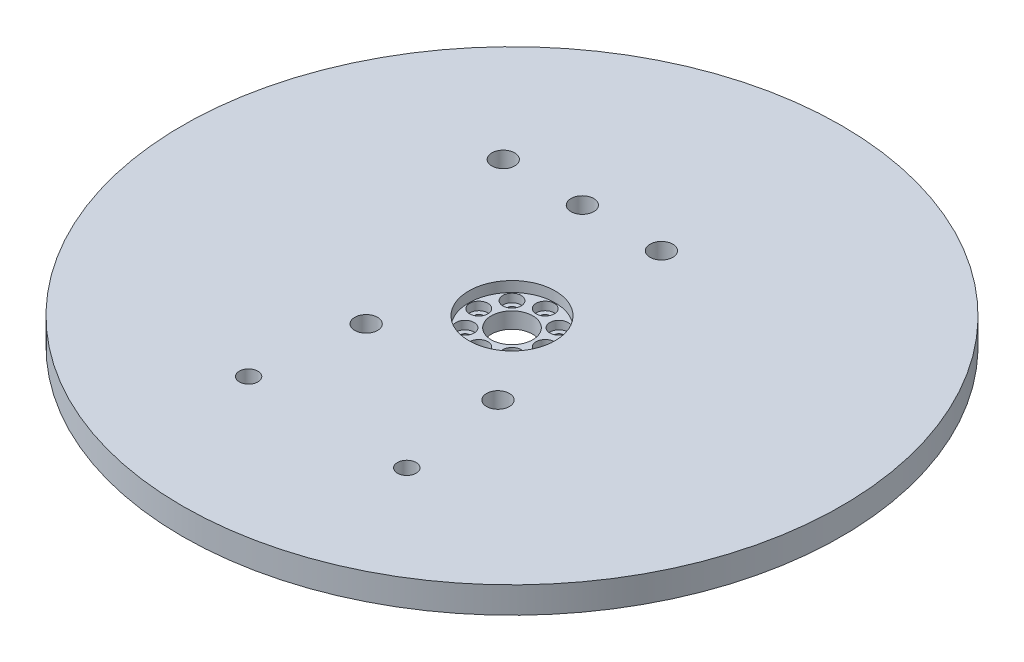
ISO-10303-21;
HEADER;
FILE_DESCRIPTION(('STEP AP214'),'2;1');
FILE_NAME('part.step','',(''),(''),'','','');
FILE_SCHEMA(('AUTOMOTIVE_DESIGN { 1 0 10303 214 1 1 1 1 }'));
ENDSEC;
DATA;
#1=APPLICATION_CONTEXT('core data for automotive mechanical design processes');
#2=APPLICATION_PROTOCOL_DEFINITION('international standard','automotive_design',2000,#1);
#3=PRODUCT_CONTEXT('',#1,'mechanical');
#4=PRODUCT('Part','Part','',(#3));
#5=PRODUCT_RELATED_PRODUCT_CATEGORY('part','',(#4));
#6=PRODUCT_DEFINITION_FORMATION('','',#4);
#7=PRODUCT_DEFINITION_CONTEXT('part definition',#1,'design');
#8=PRODUCT_DEFINITION('design','',#6,#7);
#9=PRODUCT_DEFINITION_SHAPE('','',#8);
#10=(LENGTH_UNIT() NAMED_UNIT(*) SI_UNIT(.MILLI.,.METRE.));
#11=(NAMED_UNIT(*) PLANE_ANGLE_UNIT() SI_UNIT($,.RADIAN.));
#12=(NAMED_UNIT(*) SI_UNIT($,.STERADIAN.) SOLID_ANGLE_UNIT());
#13=UNCERTAINTY_MEASURE_WITH_UNIT(LENGTH_MEASURE(1.E-05),#10,'distance_accuracy_value','');
#14=(GEOMETRIC_REPRESENTATION_CONTEXT(3) GLOBAL_UNCERTAINTY_ASSIGNED_CONTEXT((#13)) GLOBAL_UNIT_ASSIGNED_CONTEXT((#10,
#11,#12)) REPRESENTATION_CONTEXT('',''));
#15=CARTESIAN_POINT('',(0.,0.,0.));
#16=DIRECTION('',(0.,0.,1.));
#17=DIRECTION('',(1.,0.,0.));
#18=AXIS2_PLACEMENT_3D('',#15,#16,#17);
#19=CARTESIAN_POINT('',(0.,3.175,0.));
#20=DIRECTION('',(0.,-1.,0.));
#21=DIRECTION('',(0.,0.,-1.));
#22=AXIS2_PLACEMENT_3D('',#19,#20,#21);
#23=CYLINDRICAL_SURFACE('',#22,79.375);
#24=CARTESIAN_POINT('',(0.,3.175,0.));
#25=DIRECTION('',(0.,1.,0.));
#26=DIRECTION('',(0.,0.,1.));
#27=AXIS2_PLACEMENT_3D('',#24,#25,#26);
#28=CIRCLE('',#27,79.375);
#29=CARTESIAN_POINT('',(0.,3.175,79.375));
#30=VERTEX_POINT('',#29);
#31=EDGE_CURVE('E11',#30,#30,#28,.T.);
#32=ORIENTED_EDGE('',*,*,#31,.F.);
#33=EDGE_LOOP('',(#32));
#34=FACE_BOUND('',#33,.T.);
#35=CARTESIAN_POINT('',(0.,-3.175,0.));
#36=DIRECTION('',(0.,1.,0.));
#37=DIRECTION('',(0.,0.,1.));
#38=AXIS2_PLACEMENT_3D('',#35,#36,#37);
#39=CIRCLE('',#38,79.375);
#40=CARTESIAN_POINT('',(0.,-3.175,79.375));
#41=VERTEX_POINT('',#40);
#42=EDGE_CURVE('E46',#41,#41,#39,.T.);
#43=ORIENTED_EDGE('',*,*,#42,.T.);
#44=EDGE_LOOP('',(#43));
#45=FACE_BOUND('',#44,.T.);
#46=ADVANCED_FACE('F39',(#34,#45),#23,.T.);
#47=CARTESIAN_POINT('',(0.,3.175,0.));
#48=DIRECTION('',(0.,1.,0.));
#49=DIRECTION('',(0.,0.,1.));
#50=AXIS2_PLACEMENT_3D('',#47,#48,#49);
#51=PLANE('',#50);
#52=CARTESIAN_POINT('',(-33.6688086,3.175,-31.5673879519193));
#53=DIRECTION('',(0.,1.,0.));
#54=DIRECTION('',(0.,0.,1.));
#55=AXIS2_PLACEMENT_3D('',#52,#53,#54);
#56=CIRCLE('',#55,2.75);
#57=CARTESIAN_POINT('',(-33.6688086,3.175,-28.8173879519193));
#58=VERTEX_POINT('',#57);
#59=EDGE_CURVE('E362',#58,#58,#56,.T.);
#60=ORIENTED_EDGE('',*,*,#59,.F.);
#61=EDGE_LOOP('',(#60));
#62=FACE_BOUND('',#61,.T.);
#63=CARTESIAN_POINT('',(-14.6188085999999,3.175,-31.5673879519193));
#64=DIRECTION('',(0.,1.,0.));
#65=DIRECTION('',(0.,0.,1.));
#66=AXIS2_PLACEMENT_3D('',#63,#64,#65);
#67=CIRCLE('',#66,2.75);
#68=CARTESIAN_POINT('',(-14.6188085999999,3.175,-28.8173879519193));
#69=VERTEX_POINT('',#68);
#70=EDGE_CURVE('E364',#69,#69,#67,.T.);
#71=ORIENTED_EDGE('',*,*,#70,.F.);
#72=EDGE_LOOP('',(#71));
#73=FACE_BOUND('',#72,.T.);
#74=CARTESIAN_POINT('',(4.43119140000003,3.175,-31.5673879519193));
#75=DIRECTION('',(0.,1.,0.));
#76=DIRECTION('',(0.,0.,1.));
#77=AXIS2_PLACEMENT_3D('',#74,#75,#76);
#78=CIRCLE('',#77,2.75);
#79=CARTESIAN_POINT('',(4.43119140000003,3.175,-28.8173879519193));
#80=VERTEX_POINT('',#79);
#81=EDGE_CURVE('E370',#80,#80,#78,.T.);
#82=ORIENTED_EDGE('',*,*,#81,.F.);
#83=EDGE_LOOP('',(#82));
#84=FACE_BOUND('',#83,.T.);
#85=CARTESIAN_POINT('',(-15.875,3.175,19.2497064480811));
#86=DIRECTION('',(0.,1.,0.));
#87=DIRECTION('',(0.,0.,1.));
#88=AXIS2_PLACEMENT_3D('',#85,#86,#87);
#89=CIRCLE('',#88,2.75);
#90=CARTESIAN_POINT('',(-15.875,3.175,21.9997064480811));
#91=VERTEX_POINT('',#90);
#92=EDGE_CURVE('E374',#91,#91,#89,.T.);
#93=ORIENTED_EDGE('',*,*,#92,.F.);
#94=EDGE_LOOP('',(#93));
#95=FACE_BOUND('',#94,.T.);
#96=CARTESIAN_POINT('',(15.875,3.175,19.2497064480811));
#97=DIRECTION('',(0.,1.,0.));
#98=DIRECTION('',(0.,0.,1.));
#99=AXIS2_PLACEMENT_3D('',#96,#97,#98);
#100=CIRCLE('',#99,2.75);
#101=CARTESIAN_POINT('',(15.875,3.175,21.9997064480811));
#102=VERTEX_POINT('',#101);
#103=EDGE_CURVE('E378',#102,#102,#100,.T.);
#104=ORIENTED_EDGE('',*,*,#103,.F.);
#105=EDGE_LOOP('',(#104));
#106=FACE_BOUND('',#105,.T.);
#107=CARTESIAN_POINT('',(19.0500000000001,3.175,44.3882120480811));
#108=DIRECTION('',(0.,1.,0.));
#109=DIRECTION('',(0.,0.,1.));
#110=AXIS2_PLACEMENT_3D('',#107,#108,#109);
#111=CIRCLE('',#110,2.25);
#112=CARTESIAN_POINT('',(19.0500000000001,3.175,46.6382120480811));
#113=VERTEX_POINT('',#112);
#114=EDGE_CURVE('E382',#113,#113,#111,.T.);
#115=ORIENTED_EDGE('',*,*,#114,.F.);
#116=EDGE_LOOP('',(#115));
#117=FACE_BOUND('',#116,.T.);
#118=CARTESIAN_POINT('',(-19.0499999999999,3.175,44.3882120480811));
#119=DIRECTION('',(0.,1.,0.));
#120=DIRECTION('',(0.,0.,1.));
#121=AXIS2_PLACEMENT_3D('',#118,#119,#120);
#122=CIRCLE('',#121,2.25);
#123=CARTESIAN_POINT('',(-19.0499999999999,3.175,46.6382120480811));
#124=VERTEX_POINT('',#123);
#125=EDGE_CURVE('E386',#124,#124,#122,.T.);
#126=ORIENTED_EDGE('',*,*,#125,.F.);
#127=EDGE_LOOP('',(#126));
#128=FACE_BOUND('',#127,.T.);
#129=CARTESIAN_POINT('',(0.,3.175,0.));
#130=DIRECTION('',(0.,1.,0.));
#131=DIRECTION('',(0.,0.,1.));
#132=AXIS2_PLACEMENT_3D('',#129,#130,#131);
#133=CIRCLE('',#132,10.4);
#134=CARTESIAN_POINT('',(0.,3.175,10.4));
#135=VERTEX_POINT('',#134);
#136=EDGE_CURVE('E59',#135,#135,#133,.T.);
#137=ORIENTED_EDGE('',*,*,#136,.F.);
#138=EDGE_LOOP('',(#137));
#139=FACE_BOUND('',#138,.T.);
#140=ORIENTED_EDGE('',*,*,#31,.T.);
#141=EDGE_LOOP('',(#140));
#142=FACE_BOUND('',#141,.T.);
#143=ADVANCED_FACE('F173',(#62,#73,#84,#95,#106,#117,#128,#139,#142),#51,.T.);
#144=CARTESIAN_POINT('',(0.,-3.175,0.));
#145=DIRECTION('',(0.,1.,0.));
#146=DIRECTION('',(0.,0.,1.));
#147=AXIS2_PLACEMENT_3D('',#144,#145,#146);
#148=PLANE('',#147);
#149=CARTESIAN_POINT('',(-33.6688086,-3.175,-31.5673879519193));
#150=DIRECTION('',(0.,1.,0.));
#151=DIRECTION('',(0.,0.,1.));
#152=AXIS2_PLACEMENT_3D('',#149,#150,#151);
#153=CIRCLE('',#152,2.75);
#154=CARTESIAN_POINT('',(-33.6688086,-3.175,-28.8173879519193));
#155=VERTEX_POINT('',#154);
#156=EDGE_CURVE('E190',#155,#155,#153,.T.);
#157=ORIENTED_EDGE('',*,*,#156,.T.);
#158=EDGE_LOOP('',(#157));
#159=FACE_BOUND('',#158,.T.);
#160=CARTESIAN_POINT('',(-14.6188085999999,-3.175,-31.5673879519193));
#161=DIRECTION('',(0.,1.,0.));
#162=DIRECTION('',(0.,0.,1.));
#163=AXIS2_PLACEMENT_3D('',#160,#161,#162);
#164=CIRCLE('',#163,2.75);
#165=CARTESIAN_POINT('',(-14.6188085999999,-3.175,-28.8173879519193));
#166=VERTEX_POINT('',#165);
#167=EDGE_CURVE('E194',#166,#166,#164,.T.);
#168=ORIENTED_EDGE('',*,*,#167,.T.);
#169=EDGE_LOOP('',(#168));
#170=FACE_BOUND('',#169,.T.);
#171=CARTESIAN_POINT('',(4.43119140000003,-3.175,-31.5673879519193));
#172=DIRECTION('',(0.,1.,0.));
#173=DIRECTION('',(0.,0.,1.));
#174=AXIS2_PLACEMENT_3D('',#171,#172,#173);
#175=CIRCLE('',#174,2.75);
#176=CARTESIAN_POINT('',(4.43119140000003,-3.175,-28.8173879519193));
#177=VERTEX_POINT('',#176);
#178=EDGE_CURVE('E198',#177,#177,#175,.T.);
#179=ORIENTED_EDGE('',*,*,#178,.T.);
#180=EDGE_LOOP('',(#179));
#181=FACE_BOUND('',#180,.T.);
#182=CARTESIAN_POINT('',(-15.875,-3.175,19.2497064480811));
#183=DIRECTION('',(0.,1.,0.));
#184=DIRECTION('',(0.,0.,1.));
#185=AXIS2_PLACEMENT_3D('',#182,#183,#184);
#186=CIRCLE('',#185,2.75);
#187=CARTESIAN_POINT('',(-15.875,-3.175,21.9997064480811));
#188=VERTEX_POINT('',#187);
#189=EDGE_CURVE('E202',#188,#188,#186,.T.);
#190=ORIENTED_EDGE('',*,*,#189,.T.);
#191=EDGE_LOOP('',(#190));
#192=FACE_BOUND('',#191,.T.);
#193=CARTESIAN_POINT('',(15.875,-3.175,19.2497064480811));
#194=DIRECTION('',(0.,1.,0.));
#195=DIRECTION('',(0.,0.,1.));
#196=AXIS2_PLACEMENT_3D('',#193,#194,#195);
#197=CIRCLE('',#196,2.75);
#198=CARTESIAN_POINT('',(15.875,-3.175,21.9997064480811));
#199=VERTEX_POINT('',#198);
#200=EDGE_CURVE('E206',#199,#199,#197,.T.);
#201=ORIENTED_EDGE('',*,*,#200,.T.);
#202=EDGE_LOOP('',(#201));
#203=FACE_BOUND('',#202,.T.);
#204=CARTESIAN_POINT('',(19.0500000000001,-3.175,44.3882120480811));
#205=DIRECTION('',(0.,1.,0.));
#206=DIRECTION('',(0.,0.,1.));
#207=AXIS2_PLACEMENT_3D('',#204,#205,#206);
#208=CIRCLE('',#207,2.25);
#209=CARTESIAN_POINT('',(19.0500000000001,-3.175,46.6382120480811));
#210=VERTEX_POINT('',#209);
#211=EDGE_CURVE('E210',#210,#210,#208,.T.);
#212=ORIENTED_EDGE('',*,*,#211,.T.);
#213=EDGE_LOOP('',(#212));
#214=FACE_BOUND('',#213,.T.);
#215=CARTESIAN_POINT('',(-19.0499999999999,-3.175,44.3882120480811));
#216=DIRECTION('',(0.,1.,0.));
#217=DIRECTION('',(0.,0.,1.));
#218=AXIS2_PLACEMENT_3D('',#215,#216,#217);
#219=CIRCLE('',#218,2.25);
#220=CARTESIAN_POINT('',(-19.0499999999999,-3.175,46.6382120480811));
#221=VERTEX_POINT('',#220);
#222=EDGE_CURVE('E214',#221,#221,#219,.T.);
#223=ORIENTED_EDGE('',*,*,#222,.T.);
#224=EDGE_LOOP('',(#223));
#225=FACE_BOUND('',#224,.T.);
#226=CARTESIAN_POINT('',(-5.6568542495,-3.175,-5.6568542495));
#227=DIRECTION('',(0.,1.,0.));
#228=DIRECTION('',(0.,0.,1.));
#229=AXIS2_PLACEMENT_3D('',#226,#227,#228);
#230=CIRCLE('',#229,1.1);
#231=CARTESIAN_POINT('',(-5.6568542495,-3.175,-4.5568542495));
#232=VERTEX_POINT('',#231);
#233=EDGE_CURVE('E42',#232,#232,#230,.T.);
#234=ORIENTED_EDGE('',*,*,#233,.T.);
#235=EDGE_LOOP('',(#234));
#236=FACE_BOUND('',#235,.T.);
#237=CARTESIAN_POINT('',(0.,-3.175,-8.));
#238=DIRECTION('',(0.,1.,0.));
#239=DIRECTION('',(0.,0.,1.));
#240=AXIS2_PLACEMENT_3D('',#237,#238,#239);
#241=CIRCLE('',#240,1.1);
#242=CARTESIAN_POINT('',(0.,-3.175,-6.9));
#243=VERTEX_POINT('',#242);
#244=EDGE_CURVE('E89',#243,#243,#241,.T.);
#245=ORIENTED_EDGE('',*,*,#244,.T.);
#246=EDGE_LOOP('',(#245));
#247=FACE_BOUND('',#246,.T.);
#248=CARTESIAN_POINT('',(5.6568542495,-3.175,-5.6568542495));
#249=DIRECTION('',(0.,1.,0.));
#250=DIRECTION('',(0.,0.,1.));
#251=AXIS2_PLACEMENT_3D('',#248,#249,#250);
#252=CIRCLE('',#251,1.1);
#253=CARTESIAN_POINT('',(5.6568542495,-3.175,-4.5568542495));
#254=VERTEX_POINT('',#253);
#255=EDGE_CURVE('E85',#254,#254,#252,.T.);
#256=ORIENTED_EDGE('',*,*,#255,.T.);
#257=EDGE_LOOP('',(#256));
#258=FACE_BOUND('',#257,.T.);
#259=CARTESIAN_POINT('',(8.,-3.175,0.));
#260=DIRECTION('',(0.,1.,0.));
#261=DIRECTION('',(0.,0.,1.));
#262=AXIS2_PLACEMENT_3D('',#259,#260,#261);
#263=CIRCLE('',#262,1.1);
#264=CARTESIAN_POINT('',(8.,-3.175,1.1));
#265=VERTEX_POINT('',#264);
#266=EDGE_CURVE('E80',#265,#265,#263,.T.);
#267=ORIENTED_EDGE('',*,*,#266,.T.);
#268=EDGE_LOOP('',(#267));
#269=FACE_BOUND('',#268,.T.);
#270=CARTESIAN_POINT('',(5.6568542495,-3.175,5.6568542495));
#271=DIRECTION('',(0.,1.,0.));
#272=DIRECTION('',(0.,0.,1.));
#273=AXIS2_PLACEMENT_3D('',#270,#271,#272);
#274=CIRCLE('',#273,1.1);
#275=CARTESIAN_POINT('',(5.6568542495,-3.175,6.7568542495));
#276=VERTEX_POINT('',#275);
#277=EDGE_CURVE('E75',#276,#276,#274,.T.);
#278=ORIENTED_EDGE('',*,*,#277,.T.);
#279=EDGE_LOOP('',(#278));
#280=FACE_BOUND('',#279,.T.);
#281=CARTESIAN_POINT('',(0.,-3.175,8.));
#282=DIRECTION('',(0.,1.,0.));
#283=DIRECTION('',(0.,0.,1.));
#284=AXIS2_PLACEMENT_3D('',#281,#282,#283);
#285=CIRCLE('',#284,1.1);
#286=CARTESIAN_POINT('',(0.,-3.175,9.1));
#287=VERTEX_POINT('',#286);
#288=EDGE_CURVE('E70',#287,#287,#285,.T.);
#289=ORIENTED_EDGE('',*,*,#288,.T.);
#290=EDGE_LOOP('',(#289));
#291=FACE_BOUND('',#290,.T.);
#292=CARTESIAN_POINT('',(-5.6568542495,-3.175,5.6568542495));
#293=DIRECTION('',(0.,1.,0.));
#294=DIRECTION('',(0.,0.,1.));
#295=AXIS2_PLACEMENT_3D('',#292,#293,#294);
#296=CIRCLE('',#295,1.1);
#297=CARTESIAN_POINT('',(-5.6568542495,-3.175,6.7568542495));
#298=VERTEX_POINT('',#297);
#299=EDGE_CURVE('E65',#298,#298,#296,.T.);
#300=ORIENTED_EDGE('',*,*,#299,.T.);
#301=EDGE_LOOP('',(#300));
#302=FACE_BOUND('',#301,.T.);
#303=CARTESIAN_POINT('',(-8.,-3.175,0.));
#304=DIRECTION('',(0.,1.,0.));
#305=DIRECTION('',(0.,0.,1.));
#306=AXIS2_PLACEMENT_3D('',#303,#304,#305);
#307=CIRCLE('',#306,1.1);
#308=CARTESIAN_POINT('',(-8.,-3.175,1.1));
#309=VERTEX_POINT('',#308);
#310=EDGE_CURVE('E61',#309,#309,#307,.T.);
#311=ORIENTED_EDGE('',*,*,#310,.T.);
#312=EDGE_LOOP('',(#311));
#313=FACE_BOUND('',#312,.T.);
#314=CARTESIAN_POINT('',(0.,-3.175,0.));
#315=DIRECTION('',(0.,1.,0.));
#316=DIRECTION('',(0.,0.,1.));
#317=AXIS2_PLACEMENT_3D('',#314,#315,#316);
#318=CIRCLE('',#317,5.);
#319=CARTESIAN_POINT('',(0.,-3.175,5.));
#320=VERTEX_POINT('',#319);
#321=EDGE_CURVE('E60',#320,#320,#318,.T.);
#322=ORIENTED_EDGE('',*,*,#321,.T.);
#323=EDGE_LOOP('',(#322));
#324=FACE_BOUND('',#323,.T.);
#325=ORIENTED_EDGE('',*,*,#42,.F.);
#326=EDGE_LOOP('',(#325));
#327=FACE_BOUND('',#326,.T.);
#328=ADVANCED_FACE('F168',(#159,#170,#181,#192,#203,#214,#225,#236,#247,#258,#269,#280,#291,
#302,#313,#324,#327),#148,.F.);
#329=CARTESIAN_POINT('',(0.,-31.2406420973604,0.));
#330=DIRECTION('',(0.,1.,0.));
#331=DIRECTION('',(0.,0.,1.));
#332=AXIS2_PLACEMENT_3D('',#329,#330,#331);
#333=CYLINDRICAL_SURFACE('',#332,10.4);
#334=CARTESIAN_POINT('',(0.,0.674999999999998,0.));
#335=DIRECTION('',(0.,1.,0.));
#336=DIRECTION('',(0.,0.,1.));
#337=AXIS2_PLACEMENT_3D('',#334,#335,#336);
#338=CIRCLE('',#337,10.4);
#339=CARTESIAN_POINT('',(0.,0.674999999999998,10.4));
#340=VERTEX_POINT('',#339);
#341=EDGE_CURVE('E51',#340,#340,#338,.F.);
#342=ORIENTED_EDGE('',*,*,#341,.T.);
#343=EDGE_LOOP('',(#342));
#344=FACE_BOUND('',#343,.T.);
#345=ORIENTED_EDGE('',*,*,#136,.T.);
#346=EDGE_LOOP('',(#345));
#347=FACE_BOUND('',#346,.T.);
#348=ADVANCED_FACE('F154',(#344,#347),#333,.F.);
#349=CARTESIAN_POINT('',(0.,0.675,0.));
#350=DIRECTION('',(0.,1.,0.));
#351=DIRECTION('',(0.,0.,1.));
#352=AXIS2_PLACEMENT_3D('',#349,#350,#351);
#353=PLANE('',#352);
#354=CARTESIAN_POINT('',(-5.6568542495,0.675,-5.6568542495));
#355=DIRECTION('',(0.,1.,0.));
#356=DIRECTION('',(0.,0.,1.));
#357=AXIS2_PLACEMENT_3D('',#354,#355,#356);
#358=CIRCLE('',#357,2.19999999999999);
#359=CARTESIAN_POINT('',(-5.6568542495,0.675,-3.45685424950001));
#360=VERTEX_POINT('',#359);
#361=EDGE_CURVE('E390',#360,#360,#358,.T.);
#362=ORIENTED_EDGE('',*,*,#361,.F.);
#363=EDGE_LOOP('',(#362));
#364=FACE_BOUND('',#363,.T.);
#365=CARTESIAN_POINT('',(0.,0.675,-8.));
#366=DIRECTION('',(0.,1.,0.));
#367=DIRECTION('',(0.,0.,1.));
#368=AXIS2_PLACEMENT_3D('',#365,#366,#367);
#369=CIRCLE('',#368,2.19999999999999);
#370=CARTESIAN_POINT('',(0.,0.675,-5.80000000000001));
#371=VERTEX_POINT('',#370);
#372=EDGE_CURVE('E104',#371,#371,#369,.T.);
#373=ORIENTED_EDGE('',*,*,#372,.F.);
#374=EDGE_LOOP('',(#373));
#375=FACE_BOUND('',#374,.T.);
#376=CARTESIAN_POINT('',(5.6568542495,0.675,-5.6568542495));
#377=DIRECTION('',(0.,1.,0.));
#378=DIRECTION('',(0.,0.,1.));
#379=AXIS2_PLACEMENT_3D('',#376,#377,#378);
#380=CIRCLE('',#379,2.19999999999999);
#381=CARTESIAN_POINT('',(5.6568542495,0.675,-3.45685424950001));
#382=VERTEX_POINT('',#381);
#383=EDGE_CURVE('E91',#382,#382,#380,.T.);
#384=ORIENTED_EDGE('',*,*,#383,.F.);
#385=EDGE_LOOP('',(#384));
#386=FACE_BOUND('',#385,.T.);
#387=CARTESIAN_POINT('',(8.,0.675,0.));
#388=DIRECTION('',(0.,1.,0.));
#389=DIRECTION('',(0.,0.,1.));
#390=AXIS2_PLACEMENT_3D('',#387,#388,#389);
#391=CIRCLE('',#390,2.19999999999999);
#392=CARTESIAN_POINT('',(8.,0.675,2.19999999999999));
#393=VERTEX_POINT('',#392);
#394=EDGE_CURVE('E87',#393,#393,#391,.T.);
#395=ORIENTED_EDGE('',*,*,#394,.F.);
#396=EDGE_LOOP('',(#395));
#397=FACE_BOUND('',#396,.T.);
#398=CARTESIAN_POINT('',(5.6568542495,0.675,5.6568542495));
#399=DIRECTION('',(0.,1.,0.));
#400=DIRECTION('',(0.,0.,1.));
#401=AXIS2_PLACEMENT_3D('',#398,#399,#400);
#402=CIRCLE('',#401,2.19999999999999);
#403=CARTESIAN_POINT('',(5.6568542495,0.675,7.85685424949999));
#404=VERTEX_POINT('',#403);
#405=EDGE_CURVE('E83',#404,#404,#402,.T.);
#406=ORIENTED_EDGE('',*,*,#405,.F.);
#407=EDGE_LOOP('',(#406));
#408=FACE_BOUND('',#407,.T.);
#409=CARTESIAN_POINT('',(0.,0.675,8.));
#410=DIRECTION('',(0.,1.,0.));
#411=DIRECTION('',(0.,0.,1.));
#412=AXIS2_PLACEMENT_3D('',#409,#410,#411);
#413=CIRCLE('',#412,2.19999999999999);
#414=CARTESIAN_POINT('',(0.,0.675,10.2));
#415=VERTEX_POINT('',#414);
#416=EDGE_CURVE('E78',#415,#415,#413,.T.);
#417=ORIENTED_EDGE('',*,*,#416,.F.);
#418=EDGE_LOOP('',(#417));
#419=FACE_BOUND('',#418,.T.);
#420=CARTESIAN_POINT('',(-5.6568542495,0.675,5.6568542495));
#421=DIRECTION('',(0.,1.,0.));
#422=DIRECTION('',(0.,0.,1.));
#423=AXIS2_PLACEMENT_3D('',#420,#421,#422);
#424=CIRCLE('',#423,2.19999999999999);
#425=CARTESIAN_POINT('',(-5.6568542495,0.675,7.85685424949999));
#426=VERTEX_POINT('',#425);
#427=EDGE_CURVE('E73',#426,#426,#424,.T.);
#428=ORIENTED_EDGE('',*,*,#427,.F.);
#429=EDGE_LOOP('',(#428));
#430=FACE_BOUND('',#429,.T.);
#431=CARTESIAN_POINT('',(-8.,0.675,0.));
#432=DIRECTION('',(0.,1.,0.));
#433=DIRECTION('',(0.,0.,1.));
#434=AXIS2_PLACEMENT_3D('',#431,#432,#433);
#435=CIRCLE('',#434,2.19999999999999);
#436=CARTESIAN_POINT('',(-8.,0.675,2.19999999999999));
#437=VERTEX_POINT('',#436);
#438=EDGE_CURVE('E68',#437,#437,#435,.T.);
#439=ORIENTED_EDGE('',*,*,#438,.F.);
#440=EDGE_LOOP('',(#439));
#441=FACE_BOUND('',#440,.T.);
#442=CARTESIAN_POINT('',(0.,0.675,0.));
#443=DIRECTION('',(0.,1.,0.));
#444=DIRECTION('',(0.,0.,1.));
#445=AXIS2_PLACEMENT_3D('',#442,#443,#444);
#446=CIRCLE('',#445,5.);
#447=CARTESIAN_POINT('',(0.,0.675,5.));
#448=VERTEX_POINT('',#447);
#449=EDGE_CURVE('E56',#448,#448,#446,.T.);
#450=ORIENTED_EDGE('',*,*,#449,.F.);
#451=EDGE_LOOP('',(#450));
#452=FACE_BOUND('',#451,.T.);
#453=ORIENTED_EDGE('',*,*,#341,.F.);
#454=EDGE_LOOP('',(#453));
#455=FACE_BOUND('',#454,.T.);
#456=ADVANCED_FACE('F156',(#364,#375,#386,#397,#408,#419,#430,#441,#452,#455),#353,.T.);
#457=CARTESIAN_POINT('',(0.,-3.175,0.));
#458=DIRECTION('',(0.,1.,0.));
#459=DIRECTION('',(0.,0.,1.));
#460=AXIS2_PLACEMENT_3D('',#457,#458,#459);
#461=CYLINDRICAL_SURFACE('',#460,5.);
#462=ORIENTED_EDGE('',*,*,#449,.T.);
#463=EDGE_LOOP('',(#462));
#464=FACE_BOUND('',#463,.T.);
#465=ORIENTED_EDGE('',*,*,#321,.F.);
#466=EDGE_LOOP('',(#465));
#467=FACE_BOUND('',#466,.T.);
#468=ADVANCED_FACE('F158',(#464,#467),#461,.F.);
#469=CARTESIAN_POINT('',(-8.,0.675,0.));
#470=DIRECTION('',(0.,1.,0.));
#471=DIRECTION('',(0.,0.,1.));
#472=AXIS2_PLACEMENT_3D('',#469,#470,#471);
#473=CYLINDRICAL_SURFACE('',#472,1.1);
#474=CARTESIAN_POINT('',(-8.,-1.325,0.));
#475=DIRECTION('',(0.,1.,0.));
#476=DIRECTION('',(0.,0.,1.));
#477=AXIS2_PLACEMENT_3D('',#474,#475,#476);
#478=CIRCLE('',#477,1.1);
#479=CARTESIAN_POINT('',(-8.,-1.325,1.1));
#480=VERTEX_POINT('',#479);
#481=EDGE_CURVE('E64',#480,#480,#478,.T.);
#482=ORIENTED_EDGE('',*,*,#481,.T.);
#483=EDGE_LOOP('',(#482));
#484=FACE_BOUND('',#483,.T.);
#485=ORIENTED_EDGE('',*,*,#310,.F.);
#486=EDGE_LOOP('',(#485));
#487=FACE_BOUND('',#486,.T.);
#488=ADVANCED_FACE('F165',(#484,#487),#473,.F.);
#489=CARTESIAN_POINT('',(-6.9,-1.325,0.));
#490=DIRECTION('',(0.,-1.,0.));
#491=DIRECTION('',(0.,0.,-1.));
#492=AXIS2_PLACEMENT_3D('',#489,#490,#491);
#493=PLANE('',#492);
#494=ORIENTED_EDGE('',*,*,#481,.F.);
#495=EDGE_LOOP('',(#494));
#496=FACE_BOUND('',#495,.T.);
#497=CARTESIAN_POINT('',(-8.,-1.325,0.));
#498=DIRECTION('',(0.,1.,0.));
#499=DIRECTION('',(0.,0.,1.));
#500=AXIS2_PLACEMENT_3D('',#497,#498,#499);
#501=CIRCLE('',#500,2.2);
#502=CARTESIAN_POINT('',(-8.,-1.325,2.2));
#503=VERTEX_POINT('',#502);
#504=EDGE_CURVE('E142',#503,#503,#501,.T.);
#505=ORIENTED_EDGE('',*,*,#504,.T.);
#506=EDGE_LOOP('',(#505));
#507=FACE_BOUND('',#506,.T.);
#508=ADVANCED_FACE('F234',(#496,#507),#493,.F.);
#509=CARTESIAN_POINT('',(-8.,0.675,0.));
#510=DIRECTION('',(0.,1.,0.));
#511=DIRECTION('',(0.,0.,1.));
#512=AXIS2_PLACEMENT_3D('',#509,#510,#511);
#513=CYLINDRICAL_SURFACE('',#512,2.19999999999999);
#514=ORIENTED_EDGE('',*,*,#504,.F.);
#515=EDGE_LOOP('',(#514));
#516=FACE_BOUND('',#515,.T.);
#517=ORIENTED_EDGE('',*,*,#438,.T.);
#518=EDGE_LOOP('',(#517));
#519=FACE_BOUND('',#518,.T.);
#520=ADVANCED_FACE('F240',(#516,#519),#513,.F.);
#521=CARTESIAN_POINT('',(-5.6568542495,0.675,5.6568542495));
#522=DIRECTION('',(0.,1.,0.));
#523=DIRECTION('',(0.,0.,1.));
#524=AXIS2_PLACEMENT_3D('',#521,#522,#523);
#525=CYLINDRICAL_SURFACE('',#524,1.1);
#526=CARTESIAN_POINT('',(-5.6568542495,-1.325,5.6568542495));
#527=DIRECTION('',(0.,1.,0.));
#528=DIRECTION('',(0.,0.,1.));
#529=AXIS2_PLACEMENT_3D('',#526,#527,#528);
#530=CIRCLE('',#529,1.1);
#531=CARTESIAN_POINT('',(-5.6568542495,-1.325,6.7568542495));
#532=VERTEX_POINT('',#531);
#533=EDGE_CURVE('E69',#532,#532,#530,.T.);
#534=ORIENTED_EDGE('',*,*,#533,.T.);
#535=EDGE_LOOP('',(#534));
#536=FACE_BOUND('',#535,.T.);
#537=ORIENTED_EDGE('',*,*,#299,.F.);
#538=EDGE_LOOP('',(#537));
#539=FACE_BOUND('',#538,.T.);
#540=ADVANCED_FACE('F246',(#536,#539),#525,.F.);
#541=CARTESIAN_POINT('',(-4.5568542495,-1.325,5.6568542495));
#542=DIRECTION('',(0.,-1.,0.));
#543=DIRECTION('',(0.,0.,-1.));
#544=AXIS2_PLACEMENT_3D('',#541,#542,#543);
#545=PLANE('',#544);
#546=ORIENTED_EDGE('',*,*,#533,.F.);
#547=EDGE_LOOP('',(#546));
#548=FACE_BOUND('',#547,.T.);
#549=CARTESIAN_POINT('',(-5.6568542495,-1.325,5.6568542495));
#550=DIRECTION('',(0.,1.,0.));
#551=DIRECTION('',(0.,0.,1.));
#552=AXIS2_PLACEMENT_3D('',#549,#550,#551);
#553=CIRCLE('',#552,2.2);
#554=CARTESIAN_POINT('',(-5.6568542495,-1.325,7.8568542495));
#555=VERTEX_POINT('',#554);
#556=EDGE_CURVE('E135',#555,#555,#553,.T.);
#557=ORIENTED_EDGE('',*,*,#556,.T.);
#558=EDGE_LOOP('',(#557));
#559=FACE_BOUND('',#558,.T.);
#560=ADVANCED_FACE('F250',(#548,#559),#545,.F.);
#561=CARTESIAN_POINT('',(-5.6568542495,0.675,5.6568542495));
#562=DIRECTION('',(0.,1.,0.));
#563=DIRECTION('',(0.,0.,1.));
#564=AXIS2_PLACEMENT_3D('',#561,#562,#563);
#565=CYLINDRICAL_SURFACE('',#564,2.19999999999999);
#566=ORIENTED_EDGE('',*,*,#556,.F.);
#567=EDGE_LOOP('',(#566));
#568=FACE_BOUND('',#567,.T.);
#569=ORIENTED_EDGE('',*,*,#427,.T.);
#570=EDGE_LOOP('',(#569));
#571=FACE_BOUND('',#570,.T.);
#572=ADVANCED_FACE('F254',(#568,#571),#565,.F.);
#573=CARTESIAN_POINT('',(0.,0.675,8.));
#574=DIRECTION('',(0.,1.,0.));
#575=DIRECTION('',(0.,0.,1.));
#576=AXIS2_PLACEMENT_3D('',#573,#574,#575);
#577=CYLINDRICAL_SURFACE('',#576,1.1);
#578=CARTESIAN_POINT('',(0.,-1.325,8.));
#579=DIRECTION('',(0.,1.,0.));
#580=DIRECTION('',(0.,0.,1.));
#581=AXIS2_PLACEMENT_3D('',#578,#579,#580);
#582=CIRCLE('',#581,1.1);
#583=CARTESIAN_POINT('',(0.,-1.325,9.1));
#584=VERTEX_POINT('',#583);
#585=EDGE_CURVE('E74',#584,#584,#582,.T.);
#586=ORIENTED_EDGE('',*,*,#585,.T.);
#587=EDGE_LOOP('',(#586));
#588=FACE_BOUND('',#587,.T.);
#589=ORIENTED_EDGE('',*,*,#288,.F.);
#590=EDGE_LOOP('',(#589));
#591=FACE_BOUND('',#590,.T.);
#592=ADVANCED_FACE('F258',(#588,#591),#577,.F.);
#593=CARTESIAN_POINT('',(1.1,-1.325,8.));
#594=DIRECTION('',(0.,-1.,0.));
#595=DIRECTION('',(0.,0.,-1.));
#596=AXIS2_PLACEMENT_3D('',#593,#594,#595);
#597=PLANE('',#596);
#598=ORIENTED_EDGE('',*,*,#585,.F.);
#599=EDGE_LOOP('',(#598));
#600=FACE_BOUND('',#599,.T.);
#601=CARTESIAN_POINT('',(0.,-1.325,8.));
#602=DIRECTION('',(0.,1.,0.));
#603=DIRECTION('',(0.,0.,1.));
#604=AXIS2_PLACEMENT_3D('',#601,#602,#603);
#605=CIRCLE('',#604,2.2);
#606=CARTESIAN_POINT('',(0.,-1.325,10.2));
#607=VERTEX_POINT('',#606);
#608=EDGE_CURVE('E128',#607,#607,#605,.T.);
#609=ORIENTED_EDGE('',*,*,#608,.T.);
#610=EDGE_LOOP('',(#609));
#611=FACE_BOUND('',#610,.T.);
#612=ADVANCED_FACE('F262',(#600,#611),#597,.F.);
#613=CARTESIAN_POINT('',(0.,0.675,8.));
#614=DIRECTION('',(0.,1.,0.));
#615=DIRECTION('',(0.,0.,1.));
#616=AXIS2_PLACEMENT_3D('',#613,#614,#615);
#617=CYLINDRICAL_SURFACE('',#616,2.19999999999999);
#618=ORIENTED_EDGE('',*,*,#608,.F.);
#619=EDGE_LOOP('',(#618));
#620=FACE_BOUND('',#619,.T.);
#621=ORIENTED_EDGE('',*,*,#416,.T.);
#622=EDGE_LOOP('',(#621));
#623=FACE_BOUND('',#622,.T.);
#624=ADVANCED_FACE('F266',(#620,#623),#617,.F.);
#625=CARTESIAN_POINT('',(5.6568542495,0.675,5.6568542495));
#626=DIRECTION('',(0.,1.,0.));
#627=DIRECTION('',(0.,0.,1.));
#628=AXIS2_PLACEMENT_3D('',#625,#626,#627);
#629=CYLINDRICAL_SURFACE('',#628,1.1);
#630=CARTESIAN_POINT('',(5.6568542495,-1.325,5.6568542495));
#631=DIRECTION('',(0.,1.,0.));
#632=DIRECTION('',(0.,0.,1.));
#633=AXIS2_PLACEMENT_3D('',#630,#631,#632);
#634=CIRCLE('',#633,1.1);
#635=CARTESIAN_POINT('',(5.6568542495,-1.325,6.7568542495));
#636=VERTEX_POINT('',#635);
#637=EDGE_CURVE('E79',#636,#636,#634,.T.);
#638=ORIENTED_EDGE('',*,*,#637,.T.);
#639=EDGE_LOOP('',(#638));
#640=FACE_BOUND('',#639,.T.);
#641=ORIENTED_EDGE('',*,*,#277,.F.);
#642=EDGE_LOOP('',(#641));
#643=FACE_BOUND('',#642,.T.);
#644=ADVANCED_FACE('F270',(#640,#643),#629,.F.);
#645=CARTESIAN_POINT('',(6.7568542495,-1.325,5.6568542495));
#646=DIRECTION('',(0.,-1.,0.));
#647=DIRECTION('',(0.,0.,-1.));
#648=AXIS2_PLACEMENT_3D('',#645,#646,#647);
#649=PLANE('',#648);
#650=ORIENTED_EDGE('',*,*,#637,.F.);
#651=EDGE_LOOP('',(#650));
#652=FACE_BOUND('',#651,.T.);
#653=CARTESIAN_POINT('',(5.6568542495,-1.325,5.6568542495));
#654=DIRECTION('',(0.,1.,0.));
#655=DIRECTION('',(0.,0.,1.));
#656=AXIS2_PLACEMENT_3D('',#653,#654,#655);
#657=CIRCLE('',#656,2.2);
#658=CARTESIAN_POINT('',(5.6568542495,-1.325,7.8568542495));
#659=VERTEX_POINT('',#658);
#660=EDGE_CURVE('E121',#659,#659,#657,.T.);
#661=ORIENTED_EDGE('',*,*,#660,.T.);
#662=EDGE_LOOP('',(#661));
#663=FACE_BOUND('',#662,.T.);
#664=ADVANCED_FACE('F274',(#652,#663),#649,.F.);
#665=CARTESIAN_POINT('',(5.6568542495,0.675,5.6568542495));
#666=DIRECTION('',(0.,1.,0.));
#667=DIRECTION('',(0.,0.,1.));
#668=AXIS2_PLACEMENT_3D('',#665,#666,#667);
#669=CYLINDRICAL_SURFACE('',#668,2.19999999999999);
#670=ORIENTED_EDGE('',*,*,#660,.F.);
#671=EDGE_LOOP('',(#670));
#672=FACE_BOUND('',#671,.T.);
#673=ORIENTED_EDGE('',*,*,#405,.T.);
#674=EDGE_LOOP('',(#673));
#675=FACE_BOUND('',#674,.T.);
#676=ADVANCED_FACE('F278',(#672,#675),#669,.F.);
#677=CARTESIAN_POINT('',(8.,0.675,0.));
#678=DIRECTION('',(0.,1.,0.));
#679=DIRECTION('',(0.,0.,1.));
#680=AXIS2_PLACEMENT_3D('',#677,#678,#679);
#681=CYLINDRICAL_SURFACE('',#680,1.1);
#682=CARTESIAN_POINT('',(8.,-1.325,0.));
#683=DIRECTION('',(0.,1.,0.));
#684=DIRECTION('',(0.,0.,1.));
#685=AXIS2_PLACEMENT_3D('',#682,#683,#684);
#686=CIRCLE('',#685,1.1);
#687=CARTESIAN_POINT('',(8.,-1.325,1.1));
#688=VERTEX_POINT('',#687);
#689=EDGE_CURVE('E84',#688,#688,#686,.T.);
#690=ORIENTED_EDGE('',*,*,#689,.T.);
#691=EDGE_LOOP('',(#690));
#692=FACE_BOUND('',#691,.T.);
#693=ORIENTED_EDGE('',*,*,#266,.F.);
#694=EDGE_LOOP('',(#693));
#695=FACE_BOUND('',#694,.T.);
#696=ADVANCED_FACE('F282',(#692,#695),#681,.F.);
#697=CARTESIAN_POINT('',(9.1,-1.325,0.));
#698=DIRECTION('',(0.,-1.,0.));
#699=DIRECTION('',(0.,0.,-1.));
#700=AXIS2_PLACEMENT_3D('',#697,#698,#699);
#701=PLANE('',#700);
#702=ORIENTED_EDGE('',*,*,#689,.F.);
#703=EDGE_LOOP('',(#702));
#704=FACE_BOUND('',#703,.T.);
#705=CARTESIAN_POINT('',(8.,-1.325,0.));
#706=DIRECTION('',(0.,1.,0.));
#707=DIRECTION('',(0.,0.,1.));
#708=AXIS2_PLACEMENT_3D('',#705,#706,#707);
#709=CIRCLE('',#708,2.2);
#710=CARTESIAN_POINT('',(8.,-1.325,2.2));
#711=VERTEX_POINT('',#710);
#712=EDGE_CURVE('E114',#711,#711,#709,.T.);
#713=ORIENTED_EDGE('',*,*,#712,.T.);
#714=EDGE_LOOP('',(#713));
#715=FACE_BOUND('',#714,.T.);
#716=ADVANCED_FACE('F286',(#704,#715),#701,.F.);
#717=CARTESIAN_POINT('',(8.,0.675,0.));
#718=DIRECTION('',(0.,1.,0.));
#719=DIRECTION('',(0.,0.,1.));
#720=AXIS2_PLACEMENT_3D('',#717,#718,#719);
#721=CYLINDRICAL_SURFACE('',#720,2.2);
#722=ORIENTED_EDGE('',*,*,#712,.F.);
#723=EDGE_LOOP('',(#722));
#724=FACE_BOUND('',#723,.T.);
#725=ORIENTED_EDGE('',*,*,#394,.T.);
#726=EDGE_LOOP('',(#725));
#727=FACE_BOUND('',#726,.T.);
#728=ADVANCED_FACE('F290',(#724,#727),#721,.F.);
#729=CARTESIAN_POINT('',(5.6568542495,0.675,-5.6568542495));
#730=DIRECTION('',(0.,1.,0.));
#731=DIRECTION('',(0.,0.,1.));
#732=AXIS2_PLACEMENT_3D('',#729,#730,#731);
#733=CYLINDRICAL_SURFACE('',#732,1.1);
#734=CARTESIAN_POINT('',(5.6568542495,-1.325,-5.6568542495));
#735=DIRECTION('',(0.,1.,0.));
#736=DIRECTION('',(0.,0.,1.));
#737=AXIS2_PLACEMENT_3D('',#734,#735,#736);
#738=CIRCLE('',#737,1.1);
#739=CARTESIAN_POINT('',(5.6568542495,-1.325,-4.5568542495));
#740=VERTEX_POINT('',#739);
#741=EDGE_CURVE('E88',#740,#740,#738,.T.);
#742=ORIENTED_EDGE('',*,*,#741,.T.);
#743=EDGE_LOOP('',(#742));
#744=FACE_BOUND('',#743,.T.);
#745=ORIENTED_EDGE('',*,*,#255,.F.);
#746=EDGE_LOOP('',(#745));
#747=FACE_BOUND('',#746,.T.);
#748=ADVANCED_FACE('F294',(#744,#747),#733,.F.);
#749=CARTESIAN_POINT('',(6.7568542495,-1.325,-5.6568542495));
#750=DIRECTION('',(0.,-1.,0.));
#751=DIRECTION('',(0.,0.,-1.));
#752=AXIS2_PLACEMENT_3D('',#749,#750,#751);
#753=PLANE('',#752);
#754=ORIENTED_EDGE('',*,*,#741,.F.);
#755=EDGE_LOOP('',(#754));
#756=FACE_BOUND('',#755,.T.);
#757=CARTESIAN_POINT('',(5.6568542495,-1.325,-5.6568542495));
#758=DIRECTION('',(0.,1.,0.));
#759=DIRECTION('',(0.,0.,1.));
#760=AXIS2_PLACEMENT_3D('',#757,#758,#759);
#761=CIRCLE('',#760,2.2);
#762=CARTESIAN_POINT('',(5.6568542495,-1.325,-3.4568542495));
#763=VERTEX_POINT('',#762);
#764=EDGE_CURVE('E96',#763,#763,#761,.T.);
#765=ORIENTED_EDGE('',*,*,#764,.T.);
#766=EDGE_LOOP('',(#765));
#767=FACE_BOUND('',#766,.T.);
#768=ADVANCED_FACE('F298',(#756,#767),#753,.F.);
#769=CARTESIAN_POINT('',(5.6568542495,0.675,-5.6568542495));
#770=DIRECTION('',(0.,1.,0.));
#771=DIRECTION('',(0.,0.,1.));
#772=AXIS2_PLACEMENT_3D('',#769,#770,#771);
#773=CYLINDRICAL_SURFACE('',#772,2.19999999999999);
#774=ORIENTED_EDGE('',*,*,#764,.F.);
#775=EDGE_LOOP('',(#774));
#776=FACE_BOUND('',#775,.T.);
#777=ORIENTED_EDGE('',*,*,#383,.T.);
#778=EDGE_LOOP('',(#777));
#779=FACE_BOUND('',#778,.T.);
#780=ADVANCED_FACE('F302',(#776,#779),#773,.F.);
#781=CARTESIAN_POINT('',(0.,0.675,-8.));
#782=DIRECTION('',(0.,1.,0.));
#783=DIRECTION('',(0.,0.,1.));
#784=AXIS2_PLACEMENT_3D('',#781,#782,#783);
#785=CYLINDRICAL_SURFACE('',#784,1.1);
#786=CARTESIAN_POINT('',(0.,-1.325,-8.));
#787=DIRECTION('',(0.,1.,0.));
#788=DIRECTION('',(0.,0.,1.));
#789=AXIS2_PLACEMENT_3D('',#786,#787,#788);
#790=CIRCLE('',#789,1.1);
#791=CARTESIAN_POINT('',(0.,-1.325,-6.9));
#792=VERTEX_POINT('',#791);
#793=EDGE_CURVE('E92',#792,#792,#790,.T.);
#794=ORIENTED_EDGE('',*,*,#793,.T.);
#795=EDGE_LOOP('',(#794));
#796=FACE_BOUND('',#795,.T.);
#797=ORIENTED_EDGE('',*,*,#244,.F.);
#798=EDGE_LOOP('',(#797));
#799=FACE_BOUND('',#798,.T.);
#800=ADVANCED_FACE('F306',(#796,#799),#785,.F.);
#801=CARTESIAN_POINT('',(1.1,-1.325,-8.));
#802=DIRECTION('',(0.,-1.,0.));
#803=DIRECTION('',(0.,0.,-1.));
#804=AXIS2_PLACEMENT_3D('',#801,#802,#803);
#805=PLANE('',#804);
#806=ORIENTED_EDGE('',*,*,#793,.F.);
#807=EDGE_LOOP('',(#806));
#808=FACE_BOUND('',#807,.T.);
#809=CARTESIAN_POINT('',(0.,-1.325,-8.));
#810=DIRECTION('',(0.,1.,0.));
#811=DIRECTION('',(0.,0.,1.));
#812=AXIS2_PLACEMENT_3D('',#809,#810,#811);
#813=CIRCLE('',#812,2.2);
#814=CARTESIAN_POINT('',(0.,-1.325,-5.8));
#815=VERTEX_POINT('',#814);
#816=EDGE_CURVE('E99',#815,#815,#813,.T.);
#817=ORIENTED_EDGE('',*,*,#816,.T.);
#818=EDGE_LOOP('',(#817));
#819=FACE_BOUND('',#818,.T.);
#820=ADVANCED_FACE('F310',(#808,#819),#805,.F.);
#821=CARTESIAN_POINT('',(0.,0.675,-8.));
#822=DIRECTION('',(0.,1.,0.));
#823=DIRECTION('',(0.,0.,1.));
#824=AXIS2_PLACEMENT_3D('',#821,#822,#823);
#825=CYLINDRICAL_SURFACE('',#824,2.19999999999999);
#826=ORIENTED_EDGE('',*,*,#816,.F.);
#827=EDGE_LOOP('',(#826));
#828=FACE_BOUND('',#827,.T.);
#829=ORIENTED_EDGE('',*,*,#372,.T.);
#830=EDGE_LOOP('',(#829));
#831=FACE_BOUND('',#830,.T.);
#832=ADVANCED_FACE('F313',(#828,#831),#825,.F.);
#833=CARTESIAN_POINT('',(-5.6568542495,0.675,-5.6568542495));
#834=DIRECTION('',(0.,1.,0.));
#835=DIRECTION('',(0.,0.,1.));
#836=AXIS2_PLACEMENT_3D('',#833,#834,#835);
#837=CYLINDRICAL_SURFACE('',#836,1.1);
#838=CARTESIAN_POINT('',(-5.6568542495,-1.325,-5.6568542495));
#839=DIRECTION('',(0.,1.,0.));
#840=DIRECTION('',(0.,0.,1.));
#841=AXIS2_PLACEMENT_3D('',#838,#839,#840);
#842=CIRCLE('',#841,1.1);
#843=CARTESIAN_POINT('',(-5.6568542495,-1.325,-4.5568542495));
#844=VERTEX_POINT('',#843);
#845=EDGE_CURVE('E396',#844,#844,#842,.T.);
#846=ORIENTED_EDGE('',*,*,#845,.T.);
#847=EDGE_LOOP('',(#846));
#848=FACE_BOUND('',#847,.T.);
#849=ORIENTED_EDGE('',*,*,#233,.F.);
#850=EDGE_LOOP('',(#849));
#851=FACE_BOUND('',#850,.T.);
#852=ADVANCED_FACE('F317',(#848,#851),#837,.F.);
#853=CARTESIAN_POINT('',(-4.5568542495,-1.325,-5.6568542495));
#854=DIRECTION('',(0.,-1.,0.));
#855=DIRECTION('',(0.,0.,-1.));
#856=AXIS2_PLACEMENT_3D('',#853,#854,#855);
#857=PLANE('',#856);
#858=ORIENTED_EDGE('',*,*,#845,.F.);
#859=EDGE_LOOP('',(#858));
#860=FACE_BOUND('',#859,.T.);
#861=CARTESIAN_POINT('',(-5.6568542495,-1.325,-5.6568542495));
#862=DIRECTION('',(0.,1.,0.));
#863=DIRECTION('',(0.,0.,1.));
#864=AXIS2_PLACEMENT_3D('',#861,#862,#863);
#865=CIRCLE('',#864,2.2);
#866=CARTESIAN_POINT('',(-5.6568542495,-1.325,-3.4568542495));
#867=VERTEX_POINT('',#866);
#868=EDGE_CURVE('E393',#867,#867,#865,.T.);
#869=ORIENTED_EDGE('',*,*,#868,.T.);
#870=EDGE_LOOP('',(#869));
#871=FACE_BOUND('',#870,.T.);
#872=ADVANCED_FACE('F321',(#860,#871),#857,.F.);
#873=CARTESIAN_POINT('',(-5.6568542495,0.675,-5.6568542495));
#874=DIRECTION('',(0.,1.,0.));
#875=DIRECTION('',(0.,0.,1.));
#876=AXIS2_PLACEMENT_3D('',#873,#874,#875);
#877=CYLINDRICAL_SURFACE('',#876,2.19999999999999);
#878=ORIENTED_EDGE('',*,*,#868,.F.);
#879=EDGE_LOOP('',(#878));
#880=FACE_BOUND('',#879,.T.);
#881=ORIENTED_EDGE('',*,*,#361,.T.);
#882=EDGE_LOOP('',(#881));
#883=FACE_BOUND('',#882,.T.);
#884=ADVANCED_FACE('F325',(#880,#883),#877,.F.);
#885=CARTESIAN_POINT('',(-19.0499999999999,3.175,44.3882120480811));
#886=DIRECTION('',(0.,1.,0.));
#887=DIRECTION('',(0.,0.,1.));
#888=AXIS2_PLACEMENT_3D('',#885,#886,#887);
#889=CYLINDRICAL_SURFACE('',#888,2.25);
#890=ORIENTED_EDGE('',*,*,#222,.F.);
#891=EDGE_LOOP('',(#890));
#892=FACE_BOUND('',#891,.T.);
#893=ORIENTED_EDGE('',*,*,#125,.T.);
#894=EDGE_LOOP('',(#893));
#895=FACE_BOUND('',#894,.T.);
#896=ADVANCED_FACE('F329',(#892,#895),#889,.F.);
#897=CARTESIAN_POINT('',(19.0500000000001,3.175,44.3882120480811));
#898=DIRECTION('',(0.,1.,0.));
#899=DIRECTION('',(0.,0.,1.));
#900=AXIS2_PLACEMENT_3D('',#897,#898,#899);
#901=CYLINDRICAL_SURFACE('',#900,2.25);
#902=ORIENTED_EDGE('',*,*,#211,.F.);
#903=EDGE_LOOP('',(#902));
#904=FACE_BOUND('',#903,.T.);
#905=ORIENTED_EDGE('',*,*,#114,.T.);
#906=EDGE_LOOP('',(#905));
#907=FACE_BOUND('',#906,.T.);
#908=ADVANCED_FACE('F333',(#904,#907),#901,.F.);
#909=CARTESIAN_POINT('',(15.875,3.175,19.2497064480811));
#910=DIRECTION('',(0.,1.,0.));
#911=DIRECTION('',(0.,0.,1.));
#912=AXIS2_PLACEMENT_3D('',#909,#910,#911);
#913=CYLINDRICAL_SURFACE('',#912,2.75);
#914=ORIENTED_EDGE('',*,*,#200,.F.);
#915=EDGE_LOOP('',(#914));
#916=FACE_BOUND('',#915,.T.);
#917=ORIENTED_EDGE('',*,*,#103,.T.);
#918=EDGE_LOOP('',(#917));
#919=FACE_BOUND('',#918,.T.);
#920=ADVANCED_FACE('F337',(#916,#919),#913,.F.);
#921=CARTESIAN_POINT('',(-15.875,3.175,19.2497064480811));
#922=DIRECTION('',(0.,1.,0.));
#923=DIRECTION('',(0.,0.,1.));
#924=AXIS2_PLACEMENT_3D('',#921,#922,#923);
#925=CYLINDRICAL_SURFACE('',#924,2.75);
#926=ORIENTED_EDGE('',*,*,#189,.F.);
#927=EDGE_LOOP('',(#926));
#928=FACE_BOUND('',#927,.T.);
#929=ORIENTED_EDGE('',*,*,#92,.T.);
#930=EDGE_LOOP('',(#929));
#931=FACE_BOUND('',#930,.T.);
#932=ADVANCED_FACE('F341',(#928,#931),#925,.F.);
#933=CARTESIAN_POINT('',(4.43119140000003,3.175,-31.5673879519193));
#934=DIRECTION('',(0.,1.,0.));
#935=DIRECTION('',(0.,0.,1.));
#936=AXIS2_PLACEMENT_3D('',#933,#934,#935);
#937=CYLINDRICAL_SURFACE('',#936,2.75);
#938=ORIENTED_EDGE('',*,*,#178,.F.);
#939=EDGE_LOOP('',(#938));
#940=FACE_BOUND('',#939,.T.);
#941=ORIENTED_EDGE('',*,*,#81,.T.);
#942=EDGE_LOOP('',(#941));
#943=FACE_BOUND('',#942,.T.);
#944=ADVANCED_FACE('F345',(#940,#943),#937,.F.);
#945=CARTESIAN_POINT('',(-14.6188085999999,3.175,-31.5673879519193));
#946=DIRECTION('',(0.,1.,0.));
#947=DIRECTION('',(0.,0.,1.));
#948=AXIS2_PLACEMENT_3D('',#945,#946,#947);
#949=CYLINDRICAL_SURFACE('',#948,2.75);
#950=ORIENTED_EDGE('',*,*,#167,.F.);
#951=EDGE_LOOP('',(#950));
#952=FACE_BOUND('',#951,.T.);
#953=ORIENTED_EDGE('',*,*,#70,.T.);
#954=EDGE_LOOP('',(#953));
#955=FACE_BOUND('',#954,.T.);
#956=ADVANCED_FACE('F349',(#952,#955),#949,.F.);
#957=CARTESIAN_POINT('',(-33.6688086,3.175,-31.5673879519193));
#958=DIRECTION('',(0.,1.,0.));
#959=DIRECTION('',(0.,0.,1.));
#960=AXIS2_PLACEMENT_3D('',#957,#958,#959);
#961=CYLINDRICAL_SURFACE('',#960,2.75);
#962=ORIENTED_EDGE('',*,*,#156,.F.);
#963=EDGE_LOOP('',(#962));
#964=FACE_BOUND('',#963,.T.);
#965=ORIENTED_EDGE('',*,*,#59,.T.);
#966=EDGE_LOOP('',(#965));
#967=FACE_BOUND('',#966,.T.);
#968=ADVANCED_FACE('F353',(#964,#967),#961,.F.);
#969=CLOSED_SHELL('',(#46,#143,#328,#348,#456,#468,#488,#508,#520,#540,#560,#572,#592,#612,#624,
#644,#664,#676,#696,#716,#728,#748,#768,#780,#800,#820,#832,#852,#872,#884,#896,#908,#920,#932,
#944,#956,#968));
#970=MANIFOLD_SOLID_BREP('B2',#969);
#971=ADVANCED_BREP_SHAPE_REPRESENTATION('',(#18,#970),#14);
#972=SHAPE_DEFINITION_REPRESENTATION(#9,#971);
ENDSEC;
END-ISO-10303-21;
